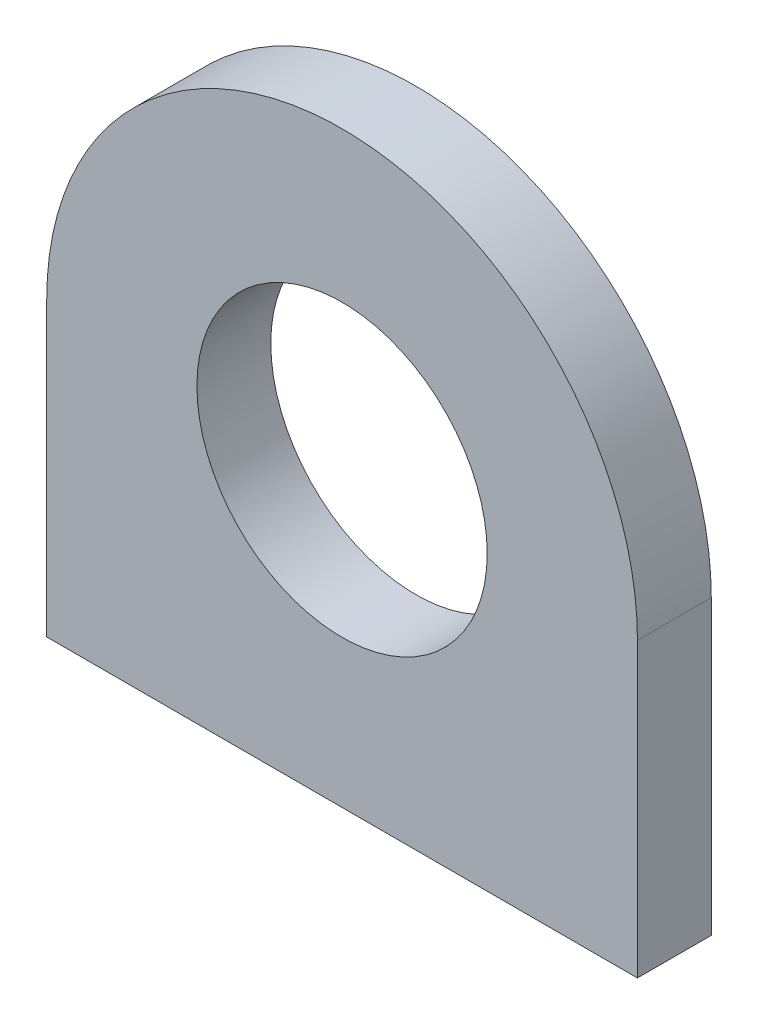
ISO-10303-21;
HEADER;
FILE_DESCRIPTION(('STEP AP214'),'2;1');
FILE_NAME('part.step','',(''),(''),'','','');
FILE_SCHEMA(('AUTOMOTIVE_DESIGN { 1 0 10303 214 1 1 1 1 }'));
ENDSEC;
DATA;
#1=APPLICATION_CONTEXT('core data for automotive mechanical design processes');
#2=APPLICATION_PROTOCOL_DEFINITION('international standard','automotive_design',2000,#1);
#3=PRODUCT_CONTEXT('',#1,'mechanical');
#4=PRODUCT('Part','Part','',(#3));
#5=PRODUCT_RELATED_PRODUCT_CATEGORY('part','',(#4));
#6=PRODUCT_DEFINITION_FORMATION('','',#4);
#7=PRODUCT_DEFINITION_CONTEXT('part definition',#1,'design');
#8=PRODUCT_DEFINITION('design','',#6,#7);
#9=PRODUCT_DEFINITION_SHAPE('','',#8);
#10=(LENGTH_UNIT() NAMED_UNIT(*) SI_UNIT(.MILLI.,.METRE.));
#11=(NAMED_UNIT(*) PLANE_ANGLE_UNIT() SI_UNIT($,.RADIAN.));
#12=(NAMED_UNIT(*) SI_UNIT($,.STERADIAN.) SOLID_ANGLE_UNIT());
#13=UNCERTAINTY_MEASURE_WITH_UNIT(LENGTH_MEASURE(1.E-05),#10,'distance_accuracy_value','');
#14=(GEOMETRIC_REPRESENTATION_CONTEXT(3) GLOBAL_UNCERTAINTY_ASSIGNED_CONTEXT((#13)) GLOBAL_UNIT_ASSIGNED_CONTEXT((#10,
#11,#12)) REPRESENTATION_CONTEXT('',''));
#15=CARTESIAN_POINT('',(0.,0.,0.));
#16=DIRECTION('',(0.,0.,1.));
#17=DIRECTION('',(1.,0.,0.));
#18=AXIS2_PLACEMENT_3D('',#15,#16,#17);
#19=CARTESIAN_POINT('',(0.,0.,3.175));
#20=DIRECTION('',(0.,0.,1.));
#21=DIRECTION('',(1.,0.,0.));
#22=AXIS2_PLACEMENT_3D('',#19,#20,#21);
#23=PLANE('',#22);
#24=CARTESIAN_POINT('',(0.,0.,3.175));
#25=DIRECTION('',(0.,0.,1.));
#26=DIRECTION('',(1.,0.,0.));
#27=AXIS2_PLACEMENT_3D('',#24,#25,#26);
#28=CIRCLE('',#27,12.7);
#29=CARTESIAN_POINT('',(12.7,0.,3.175));
#30=VERTEX_POINT('',#29);
#31=CARTESIAN_POINT('',(-12.7,0.,3.175));
#32=VERTEX_POINT('',#31);
#33=EDGE_CURVE('E85',#30,#32,#28,.T.);
#34=ORIENTED_EDGE('',*,*,#33,.T.);
#35=DIRECTION('',(0.,-1.,0.));
#36=VECTOR('',#35,1.);
#37=CARTESIAN_POINT('',(-12.7,0.,3.175));
#38=LINE('',#37,#36);
#39=CARTESIAN_POINT('',(-12.7,-12.5751134644478,3.175));
#40=VERTEX_POINT('',#39);
#41=EDGE_CURVE('E80',#32,#40,#38,.T.);
#42=ORIENTED_EDGE('',*,*,#41,.T.);
#43=DIRECTION('',(1.,0.,0.));
#44=VECTOR('',#43,1.);
#45=CARTESIAN_POINT('',(-12.7,-12.5751134644478,3.175));
#46=LINE('',#45,#44);
#47=CARTESIAN_POINT('',(12.7,-12.5751134644478,3.175));
#48=VERTEX_POINT('',#47);
#49=EDGE_CURVE('E83',#40,#48,#46,.T.);
#50=ORIENTED_EDGE('',*,*,#49,.T.);
#51=DIRECTION('',(0.,1.,0.));
#52=VECTOR('',#51,1.);
#53=CARTESIAN_POINT('',(12.7,-12.5751134644478,3.175));
#54=LINE('',#53,#52);
#55=EDGE_CURVE('E50',#48,#30,#54,.T.);
#56=ORIENTED_EDGE('',*,*,#55,.T.);
#57=EDGE_LOOP('',(#34,#42,#50,#56));
#58=FACE_BOUND('',#57,.T.);
#59=CARTESIAN_POINT('',(0.,0.,3.175));
#60=DIRECTION('',(0.,0.,1.));
#61=DIRECTION('',(1.,0.,0.));
#62=AXIS2_PLACEMENT_3D('',#59,#60,#61);
#63=CIRCLE('',#62,6.24106906729506);
#64=CARTESIAN_POINT('',(6.24106906729506,0.,3.175));
#65=VERTEX_POINT('',#64);
#66=EDGE_CURVE('E100',#65,#65,#63,.T.);
#67=ORIENTED_EDGE('',*,*,#66,.F.);
#68=EDGE_LOOP('',(#67));
#69=FACE_BOUND('',#68,.T.);
#70=ADVANCED_FACE('F33',(#58,#69),#23,.T.);
#71=CARTESIAN_POINT('',(0.,0.,0.));
#72=DIRECTION('',(0.,0.,1.));
#73=DIRECTION('',(1.,0.,0.));
#74=AXIS2_PLACEMENT_3D('',#71,#72,#73);
#75=PLANE('',#74);
#76=CARTESIAN_POINT('',(0.,0.,0.));
#77=DIRECTION('',(0.,0.,1.));
#78=DIRECTION('',(1.,0.,0.));
#79=AXIS2_PLACEMENT_3D('',#76,#77,#78);
#80=CIRCLE('',#79,12.7);
#81=CARTESIAN_POINT('',(12.7,0.,0.));
#82=VERTEX_POINT('',#81);
#83=CARTESIAN_POINT('',(-12.7,0.,0.));
#84=VERTEX_POINT('',#83);
#85=EDGE_CURVE('E97',#82,#84,#80,.T.);
#86=ORIENTED_EDGE('',*,*,#85,.F.);
#87=DIRECTION('',(0.,1.,0.));
#88=VECTOR('',#87,1.);
#89=CARTESIAN_POINT('',(12.7,-12.5751134644478,0.));
#90=LINE('',#89,#88);
#91=CARTESIAN_POINT('',(12.7,-12.5751134644478,0.));
#92=VERTEX_POINT('',#91);
#93=EDGE_CURVE('E73',#92,#82,#90,.T.);
#94=ORIENTED_EDGE('',*,*,#93,.F.);
#95=DIRECTION('',(1.,0.,0.));
#96=VECTOR('',#95,1.);
#97=CARTESIAN_POINT('',(-12.7,-12.5751134644478,0.));
#98=LINE('',#97,#96);
#99=CARTESIAN_POINT('',(-12.7,-12.5751134644478,0.));
#100=VERTEX_POINT('',#99);
#101=EDGE_CURVE('E67',#100,#92,#98,.T.);
#102=ORIENTED_EDGE('',*,*,#101,.F.);
#103=DIRECTION('',(0.,-1.,0.));
#104=VECTOR('',#103,1.);
#105=CARTESIAN_POINT('',(-12.7,0.,0.));
#106=LINE('',#105,#104);
#107=EDGE_CURVE('E89',#84,#100,#106,.T.);
#108=ORIENTED_EDGE('',*,*,#107,.F.);
#109=EDGE_LOOP('',(#86,#94,#102,#108));
#110=FACE_BOUND('',#109,.T.);
#111=CARTESIAN_POINT('',(0.,0.,0.));
#112=DIRECTION('',(0.,0.,1.));
#113=DIRECTION('',(1.,0.,0.));
#114=AXIS2_PLACEMENT_3D('',#111,#112,#113);
#115=CIRCLE('',#114,6.24106906729506);
#116=CARTESIAN_POINT('',(6.24106906729506,0.,0.));
#117=VERTEX_POINT('',#116);
#118=EDGE_CURVE('E112',#117,#117,#115,.T.);
#119=ORIENTED_EDGE('',*,*,#118,.T.);
#120=EDGE_LOOP('',(#119));
#121=FACE_BOUND('',#120,.T.);
#122=ADVANCED_FACE('F108',(#110,#121),#75,.F.);
#123=CARTESIAN_POINT('',(0.,0.,3.175));
#124=DIRECTION('',(0.,0.,-1.));
#125=DIRECTION('',(-1.,0.,0.));
#126=AXIS2_PLACEMENT_3D('',#123,#124,#125);
#127=CYLINDRICAL_SURFACE('',#126,12.7);
#128=ORIENTED_EDGE('',*,*,#85,.T.);
#129=DIRECTION('',(0.,0.,-1.));
#130=VECTOR('',#129,1.);
#131=CARTESIAN_POINT('',(-12.7,0.,3.175));
#132=LINE('',#131,#130);
#133=EDGE_CURVE('E11',#32,#84,#132,.T.);
#134=ORIENTED_EDGE('',*,*,#133,.F.);
#135=ORIENTED_EDGE('',*,*,#33,.F.);
#136=DIRECTION('',(0.,0.,-1.));
#137=VECTOR('',#136,1.);
#138=CARTESIAN_POINT('',(12.7,0.,3.175));
#139=LINE('',#138,#137);
#140=EDGE_CURVE('E93',#30,#82,#139,.T.);
#141=ORIENTED_EDGE('',*,*,#140,.T.);
#142=EDGE_LOOP('',(#128,#134,#135,#141));
#143=FACE_BOUND('',#142,.T.);
#144=ADVANCED_FACE('F35',(#143),#127,.T.);
#145=CARTESIAN_POINT('',(-12.7,0.,3.175));
#146=DIRECTION('',(1.,0.,0.));
#147=DIRECTION('',(0.,0.,-1.));
#148=AXIS2_PLACEMENT_3D('',#145,#146,#147);
#149=PLANE('',#148);
#150=ORIENTED_EDGE('',*,*,#107,.T.);
#151=DIRECTION('',(0.,0.,-1.));
#152=VECTOR('',#151,1.);
#153=CARTESIAN_POINT('',(-12.7,-12.5751134644478,3.175));
#154=LINE('',#153,#152);
#155=EDGE_CURVE('E42',#40,#100,#154,.T.);
#156=ORIENTED_EDGE('',*,*,#155,.F.);
#157=ORIENTED_EDGE('',*,*,#41,.F.);
#158=ORIENTED_EDGE('',*,*,#133,.T.);
#159=EDGE_LOOP('',(#150,#156,#157,#158));
#160=FACE_BOUND('',#159,.T.);
#161=ADVANCED_FACE('F88',(#160),#149,.F.);
#162=CARTESIAN_POINT('',(-12.7,-12.5751134644478,3.175));
#163=DIRECTION('',(0.,1.,0.));
#164=DIRECTION('',(0.,0.,1.));
#165=AXIS2_PLACEMENT_3D('',#162,#163,#164);
#166=PLANE('',#165);
#167=ORIENTED_EDGE('',*,*,#101,.T.);
#168=DIRECTION('',(0.,0.,-1.));
#169=VECTOR('',#168,1.);
#170=CARTESIAN_POINT('',(12.7,-12.5751134644478,3.175));
#171=LINE('',#170,#169);
#172=EDGE_CURVE('E90',#48,#92,#171,.T.);
#173=ORIENTED_EDGE('',*,*,#172,.F.);
#174=ORIENTED_EDGE('',*,*,#49,.F.);
#175=ORIENTED_EDGE('',*,*,#155,.T.);
#176=EDGE_LOOP('',(#167,#173,#174,#175));
#177=FACE_BOUND('',#176,.T.);
#178=ADVANCED_FACE('F91',(#177),#166,.F.);
#179=CARTESIAN_POINT('',(12.7,-12.5751134644478,3.175));
#180=DIRECTION('',(-1.,0.,0.));
#181=DIRECTION('',(0.,0.,1.));
#182=AXIS2_PLACEMENT_3D('',#179,#180,#181);
#183=PLANE('',#182);
#184=ORIENTED_EDGE('',*,*,#93,.T.);
#185=ORIENTED_EDGE('',*,*,#140,.F.);
#186=ORIENTED_EDGE('',*,*,#55,.F.);
#187=ORIENTED_EDGE('',*,*,#172,.T.);
#188=EDGE_LOOP('',(#184,#185,#186,#187));
#189=FACE_BOUND('',#188,.T.);
#190=ADVANCED_FACE('F105',(#189),#183,.F.);
#191=CARTESIAN_POINT('',(0.,0.,3.175));
#192=DIRECTION('',(0.,0.,-1.));
#193=DIRECTION('',(-1.,0.,0.));
#194=AXIS2_PLACEMENT_3D('',#191,#192,#193);
#195=CYLINDRICAL_SURFACE('',#194,6.24106906729506);
#196=ORIENTED_EDGE('',*,*,#66,.T.);
#197=EDGE_LOOP('',(#196));
#198=FACE_BOUND('',#197,.T.);
#199=ORIENTED_EDGE('',*,*,#118,.F.);
#200=EDGE_LOOP('',(#199));
#201=FACE_BOUND('',#200,.T.);
#202=ADVANCED_FACE('F118',(#198,#201),#195,.F.);
#203=CLOSED_SHELL('',(#70,#122,#144,#161,#178,#190,#202));
#204=MANIFOLD_SOLID_BREP('B2',#203);
#205=ADVANCED_BREP_SHAPE_REPRESENTATION('',(#18,#204),#14);
#206=SHAPE_DEFINITION_REPRESENTATION(#9,#205);
ENDSEC;
END-ISO-10303-21;
